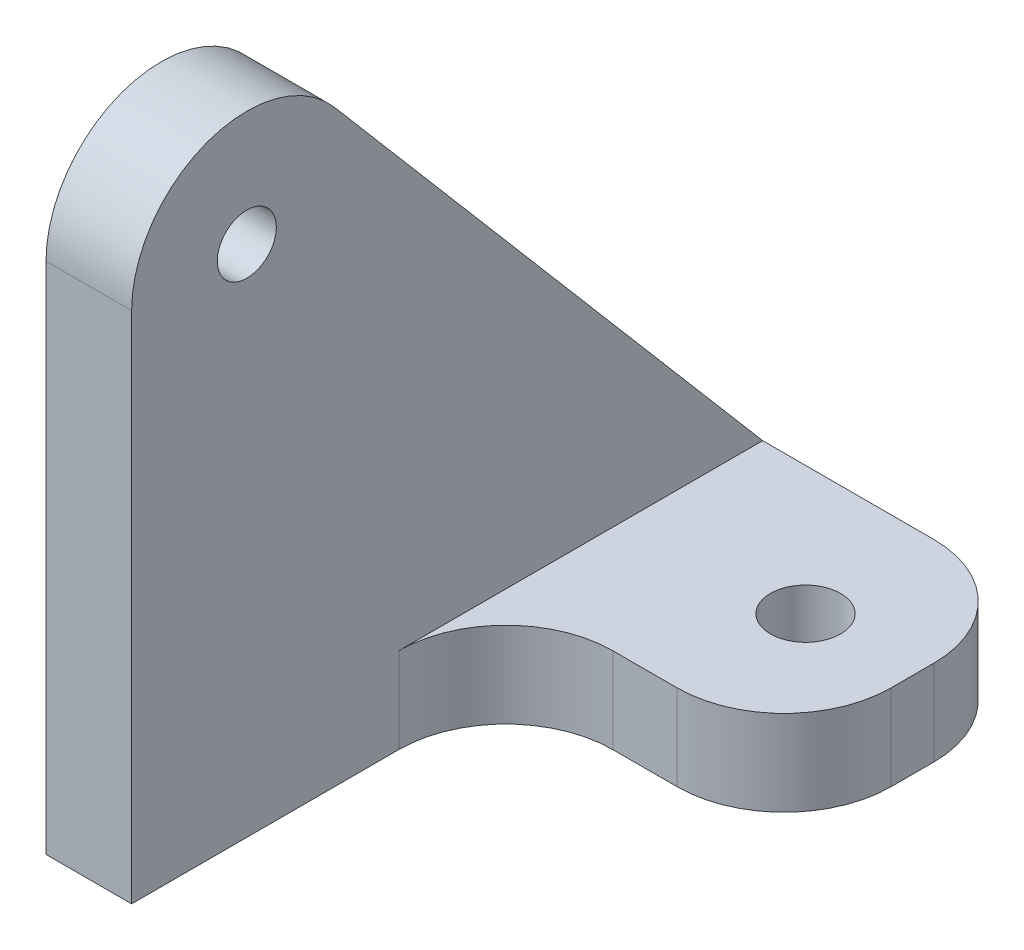
ISO-10303-21;
HEADER;
FILE_DESCRIPTION(('STEP AP214'),'2;1');
FILE_NAME('part.step','',(''),(''),'','','');
FILE_SCHEMA(('AUTOMOTIVE_DESIGN { 1 0 10303 214 1 1 1 1 }'));
ENDSEC;
DATA;
#1=APPLICATION_CONTEXT('core data for automotive mechanical design processes');
#2=APPLICATION_PROTOCOL_DEFINITION('international standard','automotive_design',2000,#1);
#3=PRODUCT_CONTEXT('',#1,'mechanical');
#4=PRODUCT('Part','Part','',(#3));
#5=PRODUCT_RELATED_PRODUCT_CATEGORY('part','',(#4));
#6=PRODUCT_DEFINITION_FORMATION('','',#4);
#7=PRODUCT_DEFINITION_CONTEXT('part definition',#1,'design');
#8=PRODUCT_DEFINITION('design','',#6,#7);
#9=PRODUCT_DEFINITION_SHAPE('','',#8);
#10=(LENGTH_UNIT() NAMED_UNIT(*) SI_UNIT(.MILLI.,.METRE.));
#11=(NAMED_UNIT(*) PLANE_ANGLE_UNIT() SI_UNIT($,.RADIAN.));
#12=(NAMED_UNIT(*) SI_UNIT($,.STERADIAN.) SOLID_ANGLE_UNIT());
#13=UNCERTAINTY_MEASURE_WITH_UNIT(LENGTH_MEASURE(1.E-05),#10,'distance_accuracy_value','');
#14=(GEOMETRIC_REPRESENTATION_CONTEXT(3) GLOBAL_UNCERTAINTY_ASSIGNED_CONTEXT((#13)) GLOBAL_UNIT_ASSIGNED_CONTEXT((#10,
#11,#12)) REPRESENTATION_CONTEXT('',''));
#15=CARTESIAN_POINT('',(0.,0.,0.));
#16=DIRECTION('',(0.,0.,1.));
#17=DIRECTION('',(1.,0.,0.));
#18=AXIS2_PLACEMENT_3D('',#15,#16,#17);
#19=CARTESIAN_POINT('',(12.7,5.08,-1.27));
#20=DIRECTION('',(0.,1.,0.));
#21=DIRECTION('',(0.,0.,1.));
#22=AXIS2_PLACEMENT_3D('',#19,#20,#21);
#23=PLANE('',#22);
#24=CARTESIAN_POINT('',(12.7,5.08,0.));
#25=DIRECTION('',(0.,1.,0.));
#26=DIRECTION('',(0.,0.,1.));
#27=AXIS2_PLACEMENT_3D('',#24,#25,#26);
#28=CIRCLE('',#27,2.0828);
#29=CARTESIAN_POINT('',(12.7,5.08,2.0828));
#30=VERTEX_POINT('',#29);
#31=EDGE_CURVE('E195',#30,#30,#28,.T.);
#32=ORIENTED_EDGE('',*,*,#31,.F.);
#33=EDGE_LOOP('',(#32));
#34=FACE_BOUND('',#33,.T.);
#35=DIRECTION('',(-1.,0.,0.));
#36=VECTOR('',#35,1.);
#37=CARTESIAN_POINT('',(-12.7,5.08,-7.62));
#38=LINE('',#37,#36);
#39=CARTESIAN_POINT('',(12.7,5.08,-7.62));
#40=VERTEX_POINT('',#39);
#41=CARTESIAN_POINT('',(2.54,5.08,-7.62));
#42=VERTEX_POINT('',#41);
#43=EDGE_CURVE('E212',#40,#42,#38,.T.);
#44=ORIENTED_EDGE('',*,*,#43,.T.);
#45=DIRECTION('',(0.,0.,1.));
#46=VECTOR('',#45,1.);
#47=CARTESIAN_POINT('',(2.54,5.08,-1.27));
#48=LINE('',#47,#46);
#49=CARTESIAN_POINT('',(2.54,5.08,13.97));
#50=VERTEX_POINT('',#49);
#51=EDGE_CURVE('E153',#42,#50,#48,.T.);
#52=ORIENTED_EDGE('',*,*,#51,.T.);
#53=CARTESIAN_POINT('',(8.89,5.08,13.97));
#54=DIRECTION('',(0.,1.,0.));
#55=DIRECTION('',(0.,0.,1.));
#56=AXIS2_PLACEMENT_3D('',#53,#54,#55);
#57=CIRCLE('',#56,6.35);
#58=CARTESIAN_POINT('',(8.89,5.08,7.61999999999999));
#59=VERTEX_POINT('',#58);
#60=EDGE_CURVE('E41',#50,#59,#57,.F.);
#61=ORIENTED_EDGE('',*,*,#60,.T.);
#62=DIRECTION('',(1.,0.,0.));
#63=VECTOR('',#62,1.);
#64=CARTESIAN_POINT('',(-12.6999999999999,5.08,7.61999999999999));
#65=LINE('',#64,#63);
#66=CARTESIAN_POINT('',(12.7,5.08,7.61999999999999));
#67=VERTEX_POINT('',#66);
#68=EDGE_CURVE('E221',#59,#67,#65,.T.);
#69=ORIENTED_EDGE('',*,*,#68,.T.);
#70=CARTESIAN_POINT('',(12.7,5.08,1.26999999999999));
#71=DIRECTION('',(0.,1.,0.));
#72=DIRECTION('',(0.,0.,-1.));
#73=AXIS2_PLACEMENT_3D('',#70,#71,#72);
#74=CIRCLE('',#73,6.35);
#75=CARTESIAN_POINT('',(19.05,5.08,1.26999999999995));
#76=VERTEX_POINT('',#75);
#77=EDGE_CURVE('E225',#67,#76,#74,.T.);
#78=ORIENTED_EDGE('',*,*,#77,.T.);
#79=DIRECTION('',(0.,0.,-1.));
#80=VECTOR('',#79,1.);
#81=CARTESIAN_POINT('',(19.05,5.08,1.26999999999995));
#82=LINE('',#81,#80);
#83=CARTESIAN_POINT('',(19.05,5.08,-1.27));
#84=VERTEX_POINT('',#83);
#85=EDGE_CURVE('E227',#76,#84,#82,.T.);
#86=ORIENTED_EDGE('',*,*,#85,.T.);
#87=CARTESIAN_POINT('',(12.7,5.08,-1.27));
#88=DIRECTION('',(0.,1.,0.));
#89=DIRECTION('',(0.,0.,1.));
#90=AXIS2_PLACEMENT_3D('',#87,#88,#89);
#91=CIRCLE('',#90,6.35);
#92=EDGE_CURVE('E207',#84,#40,#91,.T.);
#93=ORIENTED_EDGE('',*,*,#92,.T.);
#94=EDGE_LOOP('',(#44,#52,#61,#69,#78,#86,#93));
#95=FACE_BOUND('',#94,.T.);
#96=ADVANCED_FACE('F33',(#34,#95),#23,.T.);
#97=CARTESIAN_POINT('',(-12.6999999999999,5.08,7.61999999999999));
#98=DIRECTION('',(0.,0.,-1.));
#99=DIRECTION('',(-1.,0.,0.));
#100=AXIS2_PLACEMENT_3D('',#97,#98,#99);
#101=PLANE('',#100);
#102=ORIENTED_EDGE('',*,*,#68,.F.);
#103=DIRECTION('',(0.,1.,0.));
#104=VECTOR('',#103,1.);
#105=CARTESIAN_POINT('',(8.89,0.,7.61999999999999));
#106=LINE('',#105,#104);
#107=CARTESIAN_POINT('',(8.89,0.,7.61999999999999));
#108=VERTEX_POINT('',#107);
#109=EDGE_CURVE('E54',#59,#108,#106,.F.);
#110=ORIENTED_EDGE('',*,*,#109,.T.);
#111=DIRECTION('',(1.,0.,0.));
#112=VECTOR('',#111,1.);
#113=CARTESIAN_POINT('',(-12.6999999999999,0.,7.61999999999999));
#114=LINE('',#113,#112);
#115=CARTESIAN_POINT('',(12.7,0.,7.61999999999999));
#116=VERTEX_POINT('',#115);
#117=EDGE_CURVE('E240',#108,#116,#114,.T.);
#118=ORIENTED_EDGE('',*,*,#117,.T.);
#119=DIRECTION('',(0.,-1.,0.));
#120=VECTOR('',#119,1.);
#121=CARTESIAN_POINT('',(12.7,5.08,7.61999999999999));
#122=LINE('',#121,#120);
#123=EDGE_CURVE('E252',#67,#116,#122,.T.);
#124=ORIENTED_EDGE('',*,*,#123,.F.);
#125=EDGE_LOOP('',(#102,#110,#118,#124));
#126=FACE_BOUND('',#125,.T.);
#127=ADVANCED_FACE('F343',(#126),#101,.F.);
#128=DIRECTION('',(0.,0.,1.));
#129=VECTOR('',#128,1.);
#130=CARTESIAN_POINT('',(-2.54,5.08,-1.27));
#131=LINE('',#130,#129);
#132=CARTESIAN_POINT('',(-2.54,5.08,-7.62));
#133=VERTEX_POINT('',#132);
#134=CARTESIAN_POINT('',(-2.54,5.08,13.97));
#135=VERTEX_POINT('',#134);
#136=EDGE_CURVE('E191',#133,#135,#131,.T.);
#137=ORIENTED_EDGE('',*,*,#136,.F.);
#138=CARTESIAN_POINT('',(-12.7,5.08,-7.62));
#139=VERTEX_POINT('',#138);
#140=EDGE_CURVE('E210',#133,#139,#38,.T.);
#141=ORIENTED_EDGE('',*,*,#140,.T.);
#142=CARTESIAN_POINT('',(-12.7,5.08,-1.27));
#143=DIRECTION('',(0.,1.,0.));
#144=DIRECTION('',(0.,0.,-1.));
#145=AXIS2_PLACEMENT_3D('',#142,#143,#144);
#146=CIRCLE('',#145,6.35);
#147=CARTESIAN_POINT('',(-19.05,5.08,-1.27));
#148=VERTEX_POINT('',#147);
#149=EDGE_CURVE('E215',#139,#148,#146,.T.);
#150=ORIENTED_EDGE('',*,*,#149,.T.);
#151=DIRECTION('',(0.,0.,1.));
#152=VECTOR('',#151,1.);
#153=CARTESIAN_POINT('',(-19.05,5.08,1.26999999999995));
#154=LINE('',#153,#152);
#155=CARTESIAN_POINT('',(-19.05,5.08,1.26999999999995));
#156=VERTEX_POINT('',#155);
#157=EDGE_CURVE('E217',#148,#156,#154,.T.);
#158=ORIENTED_EDGE('',*,*,#157,.T.);
#159=CARTESIAN_POINT('',(-12.7,5.08,1.27));
#160=DIRECTION('',(0.,1.,0.));
#161=DIRECTION('',(0.,0.,-1.));
#162=AXIS2_PLACEMENT_3D('',#159,#160,#161);
#163=CIRCLE('',#162,6.35);
#164=CARTESIAN_POINT('',(-12.6999999999999,5.08,7.61999999999999));
#165=VERTEX_POINT('',#164);
#166=EDGE_CURVE('E219',#156,#165,#163,.T.);
#167=ORIENTED_EDGE('',*,*,#166,.T.);
#168=CARTESIAN_POINT('',(-8.89,5.08,7.61999999999999));
#169=VERTEX_POINT('',#168);
#170=EDGE_CURVE('E222',#165,#169,#65,.T.);
#171=ORIENTED_EDGE('',*,*,#170,.T.);
#172=CARTESIAN_POINT('',(-8.89,5.08,13.97));
#173=DIRECTION('',(0.,1.,0.));
#174=DIRECTION('',(0.,0.,1.));
#175=AXIS2_PLACEMENT_3D('',#172,#173,#174);
#176=CIRCLE('',#175,6.35);
#177=EDGE_CURVE('E278',#169,#135,#176,.F.);
#178=ORIENTED_EDGE('',*,*,#177,.T.);
#179=EDGE_LOOP('',(#137,#141,#150,#158,#167,#171,#178));
#180=FACE_BOUND('',#179,.T.);
#181=CARTESIAN_POINT('',(-12.7,5.08,0.));
#182=DIRECTION('',(0.,1.,0.));
#183=DIRECTION('',(0.,0.,1.));
#184=AXIS2_PLACEMENT_3D('',#181,#182,#183);
#185=CIRCLE('',#184,2.0828);
#186=CARTESIAN_POINT('',(-12.7,5.08,2.0828));
#187=VERTEX_POINT('',#186);
#188=EDGE_CURVE('E201',#187,#187,#185,.T.);
#189=ORIENTED_EDGE('',*,*,#188,.F.);
#190=EDGE_LOOP('',(#189));
#191=FACE_BOUND('',#190,.T.);
#192=ADVANCED_FACE('F299',(#180,#191),#23,.T.);
#193=CARTESIAN_POINT('',(12.7,0.,-1.27));
#194=DIRECTION('',(0.,1.,0.));
#195=DIRECTION('',(0.,0.,1.));
#196=AXIS2_PLACEMENT_3D('',#193,#194,#195);
#197=PLANE('',#196);
#198=CARTESIAN_POINT('',(-12.7,0.,-1.27));
#199=DIRECTION('',(0.,1.,0.));
#200=DIRECTION('',(0.,0.,-1.));
#201=AXIS2_PLACEMENT_3D('',#198,#199,#200);
#202=CIRCLE('',#201,6.35);
#203=CARTESIAN_POINT('',(-12.7,0.,-7.62));
#204=VERTEX_POINT('',#203);
#205=CARTESIAN_POINT('',(-19.05,0.,-1.27));
#206=VERTEX_POINT('',#205);
#207=EDGE_CURVE('E234',#204,#206,#202,.T.);
#208=ORIENTED_EDGE('',*,*,#207,.F.);
#209=DIRECTION('',(-1.,0.,0.));
#210=VECTOR('',#209,1.);
#211=CARTESIAN_POINT('',(-12.7,0.,-7.62));
#212=LINE('',#211,#210);
#213=CARTESIAN_POINT('',(12.7,0.,-7.62));
#214=VERTEX_POINT('',#213);
#215=EDGE_CURVE('E232',#214,#204,#212,.T.);
#216=ORIENTED_EDGE('',*,*,#215,.F.);
#217=CARTESIAN_POINT('',(12.7,0.,-1.27));
#218=DIRECTION('',(0.,1.,0.));
#219=DIRECTION('',(0.,0.,1.));
#220=AXIS2_PLACEMENT_3D('',#217,#218,#219);
#221=CIRCLE('',#220,6.35);
#222=CARTESIAN_POINT('',(19.05,0.,-1.27));
#223=VERTEX_POINT('',#222);
#224=EDGE_CURVE('E204',#223,#214,#221,.T.);
#225=ORIENTED_EDGE('',*,*,#224,.F.);
#226=DIRECTION('',(0.,0.,-1.));
#227=VECTOR('',#226,1.);
#228=CARTESIAN_POINT('',(19.05,0.,1.26999999999995));
#229=LINE('',#228,#227);
#230=CARTESIAN_POINT('',(19.05,0.,1.26999999999995));
#231=VERTEX_POINT('',#230);
#232=EDGE_CURVE('E211',#231,#223,#229,.T.);
#233=ORIENTED_EDGE('',*,*,#232,.F.);
#234=CARTESIAN_POINT('',(12.7,0.,1.26999999999999));
#235=DIRECTION('',(0.,1.,0.));
#236=DIRECTION('',(0.,0.,-1.));
#237=AXIS2_PLACEMENT_3D('',#234,#235,#236);
#238=CIRCLE('',#237,6.35);
#239=EDGE_CURVE('E244',#116,#231,#238,.T.);
#240=ORIENTED_EDGE('',*,*,#239,.F.);
#241=ORIENTED_EDGE('',*,*,#117,.F.);
#242=CARTESIAN_POINT('',(8.89,0.,13.97));
#243=DIRECTION('',(0.,1.,0.));
#244=DIRECTION('',(0.,0.,1.));
#245=AXIS2_PLACEMENT_3D('',#242,#243,#244);
#246=CIRCLE('',#245,6.35);
#247=CARTESIAN_POINT('',(2.54,0.,13.97));
#248=VERTEX_POINT('',#247);
#249=EDGE_CURVE('E11',#108,#248,#246,.T.);
#250=ORIENTED_EDGE('',*,*,#249,.T.);
#251=DIRECTION('',(0.,0.,-1.));
#252=VECTOR('',#251,1.);
#253=CARTESIAN_POINT('',(2.54,0.,29.8196));
#254=LINE('',#253,#252);
#255=CARTESIAN_POINT('',(2.54,0.,29.8196));
#256=VERTEX_POINT('',#255);
#257=EDGE_CURVE('E173',#256,#248,#254,.T.);
#258=ORIENTED_EDGE('',*,*,#257,.F.);
#259=DIRECTION('',(-1.,0.,0.));
#260=VECTOR('',#259,1.);
#261=CARTESIAN_POINT('',(2.54,0.,29.8196));
#262=LINE('',#261,#260);
#263=CARTESIAN_POINT('',(-2.54,0.,29.8196));
#264=VERTEX_POINT('',#263);
#265=EDGE_CURVE('E178',#256,#264,#262,.T.);
#266=ORIENTED_EDGE('',*,*,#265,.T.);
#267=DIRECTION('',(0.,0.,-1.));
#268=VECTOR('',#267,1.);
#269=CARTESIAN_POINT('',(-2.54,0.,29.8196));
#270=LINE('',#269,#268);
#271=CARTESIAN_POINT('',(-2.54,0.,13.97));
#272=VERTEX_POINT('',#271);
#273=EDGE_CURVE('E156',#264,#272,#270,.T.);
#274=ORIENTED_EDGE('',*,*,#273,.T.);
#275=CARTESIAN_POINT('',(-8.89,0.,13.97));
#276=DIRECTION('',(0.,1.,0.));
#277=DIRECTION('',(0.,0.,1.));
#278=AXIS2_PLACEMENT_3D('',#275,#276,#277);
#279=CIRCLE('',#278,6.35);
#280=CARTESIAN_POINT('',(-8.89,0.,7.61999999999999));
#281=VERTEX_POINT('',#280);
#282=EDGE_CURVE('E281',#272,#281,#279,.T.);
#283=ORIENTED_EDGE('',*,*,#282,.T.);
#284=CARTESIAN_POINT('',(-12.6999999999999,0.,7.61999999999999));
#285=VERTEX_POINT('',#284);
#286=EDGE_CURVE('E241',#285,#281,#114,.T.);
#287=ORIENTED_EDGE('',*,*,#286,.F.);
#288=CARTESIAN_POINT('',(-12.7,0.,1.27));
#289=DIRECTION('',(0.,1.,0.));
#290=DIRECTION('',(0.,0.,-1.));
#291=AXIS2_PLACEMENT_3D('',#288,#289,#290);
#292=CIRCLE('',#291,6.35);
#293=CARTESIAN_POINT('',(-19.05,0.,1.26999999999995));
#294=VERTEX_POINT('',#293);
#295=EDGE_CURVE('E238',#294,#285,#292,.T.);
#296=ORIENTED_EDGE('',*,*,#295,.F.);
#297=DIRECTION('',(0.,0.,1.));
#298=VECTOR('',#297,1.);
#299=CARTESIAN_POINT('',(-19.05,0.,1.26999999999995));
#300=LINE('',#299,#298);
#301=EDGE_CURVE('E236',#206,#294,#300,.T.);
#302=ORIENTED_EDGE('',*,*,#301,.F.);
#303=EDGE_LOOP('',(#208,#216,#225,#233,#240,#241,#250,#258,#266,#274,#283,#287,#296,#302));
#304=FACE_BOUND('',#303,.T.);
#305=CARTESIAN_POINT('',(-12.7,0.,0.));
#306=DIRECTION('',(0.,1.,0.));
#307=DIRECTION('',(0.,0.,1.));
#308=AXIS2_PLACEMENT_3D('',#305,#306,#307);
#309=CIRCLE('',#308,2.0828);
#310=CARTESIAN_POINT('',(-12.7,0.,2.0828));
#311=VERTEX_POINT('',#310);
#312=EDGE_CURVE('E198',#311,#311,#309,.T.);
#313=ORIENTED_EDGE('',*,*,#312,.T.);
#314=EDGE_LOOP('',(#313));
#315=FACE_BOUND('',#314,.T.);
#316=CARTESIAN_POINT('',(12.7,0.,0.));
#317=DIRECTION('',(0.,1.,0.));
#318=DIRECTION('',(0.,0.,1.));
#319=AXIS2_PLACEMENT_3D('',#316,#317,#318);
#320=CIRCLE('',#319,2.0828);
#321=CARTESIAN_POINT('',(12.7,0.,2.0828));
#322=VERTEX_POINT('',#321);
#323=EDGE_CURVE('E194',#322,#322,#320,.T.);
#324=ORIENTED_EDGE('',*,*,#323,.T.);
#325=EDGE_LOOP('',(#324));
#326=FACE_BOUND('',#325,.T.);
#327=ADVANCED_FACE('F286',(#304,#315,#326),#197,.F.);
#328=CARTESIAN_POINT('',(12.7,5.08,-1.27));
#329=DIRECTION('',(0.,-1.,0.));
#330=DIRECTION('',(0.,0.,-1.));
#331=AXIS2_PLACEMENT_3D('',#328,#329,#330);
#332=CYLINDRICAL_SURFACE('',#331,6.35);
#333=ORIENTED_EDGE('',*,*,#224,.T.);
#334=DIRECTION('',(0.,-1.,0.));
#335=VECTOR('',#334,1.);
#336=CARTESIAN_POINT('',(12.7,5.08,-7.62));
#337=LINE('',#336,#335);
#338=EDGE_CURVE('E267',#40,#214,#337,.T.);
#339=ORIENTED_EDGE('',*,*,#338,.F.);
#340=ORIENTED_EDGE('',*,*,#92,.F.);
#341=DIRECTION('',(0.,-1.,0.));
#342=VECTOR('',#341,1.);
#343=CARTESIAN_POINT('',(19.05,5.08,-1.27));
#344=LINE('',#343,#342);
#345=EDGE_CURVE('E229',#84,#223,#344,.T.);
#346=ORIENTED_EDGE('',*,*,#345,.T.);
#347=EDGE_LOOP('',(#333,#339,#340,#346));
#348=FACE_BOUND('',#347,.T.);
#349=ADVANCED_FACE('F322',(#348),#332,.T.);
#350=CARTESIAN_POINT('',(-12.7,5.08,-7.62));
#351=DIRECTION('',(0.,0.,1.));
#352=DIRECTION('',(1.,0.,0.));
#353=AXIS2_PLACEMENT_3D('',#350,#351,#352);
#354=PLANE('',#353);
#355=ORIENTED_EDGE('',*,*,#140,.F.);
#356=DIRECTION('',(-1.,0.,0.));
#357=VECTOR('',#356,1.);
#358=CARTESIAN_POINT('',(2.54,5.08,-7.62));
#359=LINE('',#358,#357);
#360=EDGE_CURVE('E165',#42,#133,#359,.T.);
#361=ORIENTED_EDGE('',*,*,#360,.F.);
#362=ORIENTED_EDGE('',*,*,#43,.F.);
#363=ORIENTED_EDGE('',*,*,#338,.T.);
#364=ORIENTED_EDGE('',*,*,#215,.T.);
#365=DIRECTION('',(0.,-1.,0.));
#366=VECTOR('',#365,1.);
#367=CARTESIAN_POINT('',(-12.7,5.08,-7.62));
#368=LINE('',#367,#366);
#369=EDGE_CURVE('E264',#139,#204,#368,.T.);
#370=ORIENTED_EDGE('',*,*,#369,.F.);
#371=EDGE_LOOP('',(#355,#361,#362,#363,#364,#370));
#372=FACE_BOUND('',#371,.T.);
#373=ADVANCED_FACE('F316',(#372),#354,.F.);
#374=CARTESIAN_POINT('',(-12.7,5.08,-1.27));
#375=DIRECTION('',(0.,-1.,0.));
#376=DIRECTION('',(0.,0.,-1.));
#377=AXIS2_PLACEMENT_3D('',#374,#375,#376);
#378=CYLINDRICAL_SURFACE('',#377,6.35);
#379=ORIENTED_EDGE('',*,*,#207,.T.);
#380=DIRECTION('',(0.,-1.,0.));
#381=VECTOR('',#380,1.);
#382=CARTESIAN_POINT('',(-19.05,5.08,-1.27));
#383=LINE('',#382,#381);
#384=EDGE_CURVE('E261',#148,#206,#383,.T.);
#385=ORIENTED_EDGE('',*,*,#384,.F.);
#386=ORIENTED_EDGE('',*,*,#149,.F.);
#387=ORIENTED_EDGE('',*,*,#369,.T.);
#388=EDGE_LOOP('',(#379,#385,#386,#387));
#389=FACE_BOUND('',#388,.T.);
#390=ADVANCED_FACE('F313',(#389),#378,.T.);
#391=CARTESIAN_POINT('',(-19.05,5.08,1.26999999999995));
#392=DIRECTION('',(1.,0.,0.));
#393=DIRECTION('',(0.,0.,-1.));
#394=AXIS2_PLACEMENT_3D('',#391,#392,#393);
#395=PLANE('',#394);
#396=ORIENTED_EDGE('',*,*,#301,.T.);
#397=DIRECTION('',(0.,-1.,0.));
#398=VECTOR('',#397,1.);
#399=CARTESIAN_POINT('',(-19.05,5.08,1.26999999999995));
#400=LINE('',#399,#398);
#401=EDGE_CURVE('E258',#156,#294,#400,.T.);
#402=ORIENTED_EDGE('',*,*,#401,.F.);
#403=ORIENTED_EDGE('',*,*,#157,.F.);
#404=ORIENTED_EDGE('',*,*,#384,.T.);
#405=EDGE_LOOP('',(#396,#402,#403,#404));
#406=FACE_BOUND('',#405,.T.);
#407=ADVANCED_FACE('F309',(#406),#395,.F.);
#408=CARTESIAN_POINT('',(-12.7,5.08,1.27));
#409=DIRECTION('',(0.,-1.,0.));
#410=DIRECTION('',(0.,0.,-1.));
#411=AXIS2_PLACEMENT_3D('',#408,#409,#410);
#412=CYLINDRICAL_SURFACE('',#411,6.35);
#413=ORIENTED_EDGE('',*,*,#295,.T.);
#414=DIRECTION('',(0.,-1.,0.));
#415=VECTOR('',#414,1.);
#416=CARTESIAN_POINT('',(-12.6999999999999,5.08,7.61999999999999));
#417=LINE('',#416,#415);
#418=EDGE_CURVE('E255',#165,#285,#417,.T.);
#419=ORIENTED_EDGE('',*,*,#418,.F.);
#420=ORIENTED_EDGE('',*,*,#166,.F.);
#421=ORIENTED_EDGE('',*,*,#401,.T.);
#422=EDGE_LOOP('',(#413,#419,#420,#421));
#423=FACE_BOUND('',#422,.T.);
#424=ADVANCED_FACE('F306',(#423),#412,.T.);
#425=ORIENTED_EDGE('',*,*,#286,.T.);
#426=DIRECTION('',(0.,1.,0.));
#427=VECTOR('',#426,1.);
#428=CARTESIAN_POINT('',(-8.89,5.08,7.61999999999999));
#429=LINE('',#428,#427);
#430=EDGE_CURVE('E270',#281,#169,#429,.T.);
#431=ORIENTED_EDGE('',*,*,#430,.T.);
#432=ORIENTED_EDGE('',*,*,#170,.F.);
#433=ORIENTED_EDGE('',*,*,#418,.T.);
#434=EDGE_LOOP('',(#425,#431,#432,#433));
#435=FACE_BOUND('',#434,.T.);
#436=ADVANCED_FACE('F294',(#435),#101,.F.);
#437=CARTESIAN_POINT('',(12.7,5.08,1.26999999999999));
#438=DIRECTION('',(0.,-1.,0.));
#439=DIRECTION('',(0.,0.,-1.));
#440=AXIS2_PLACEMENT_3D('',#437,#438,#439);
#441=CYLINDRICAL_SURFACE('',#440,6.35);
#442=ORIENTED_EDGE('',*,*,#239,.T.);
#443=DIRECTION('',(0.,-1.,0.));
#444=VECTOR('',#443,1.);
#445=CARTESIAN_POINT('',(19.05,5.08,1.26999999999995));
#446=LINE('',#445,#444);
#447=EDGE_CURVE('E249',#76,#231,#446,.T.);
#448=ORIENTED_EDGE('',*,*,#447,.F.);
#449=ORIENTED_EDGE('',*,*,#77,.F.);
#450=ORIENTED_EDGE('',*,*,#123,.T.);
#451=EDGE_LOOP('',(#442,#448,#449,#450));
#452=FACE_BOUND('',#451,.T.);
#453=ADVANCED_FACE('F331',(#452),#441,.T.);
#454=CARTESIAN_POINT('',(19.05,5.08,1.26999999999995));
#455=DIRECTION('',(-1.,0.,0.));
#456=DIRECTION('',(0.,0.,1.));
#457=AXIS2_PLACEMENT_3D('',#454,#455,#456);
#458=PLANE('',#457);
#459=ORIENTED_EDGE('',*,*,#232,.T.);
#460=ORIENTED_EDGE('',*,*,#345,.F.);
#461=ORIENTED_EDGE('',*,*,#85,.F.);
#462=ORIENTED_EDGE('',*,*,#447,.T.);
#463=EDGE_LOOP('',(#459,#460,#461,#462));
#464=FACE_BOUND('',#463,.T.);
#465=ADVANCED_FACE('F327',(#464),#458,.F.);
#466=CARTESIAN_POINT('',(-12.7,5.08,0.));
#467=DIRECTION('',(0.,-1.,0.));
#468=DIRECTION('',(0.,0.,-1.));
#469=AXIS2_PLACEMENT_3D('',#466,#467,#468);
#470=CYLINDRICAL_SURFACE('',#469,2.0828);
#471=ORIENTED_EDGE('',*,*,#188,.T.);
#472=EDGE_LOOP('',(#471));
#473=FACE_BOUND('',#472,.T.);
#474=ORIENTED_EDGE('',*,*,#312,.F.);
#475=EDGE_LOOP('',(#474));
#476=FACE_BOUND('',#475,.T.);
#477=ADVANCED_FACE('F398',(#473,#476),#470,.F.);
#478=CARTESIAN_POINT('',(12.7,5.08,0.));
#479=DIRECTION('',(0.,-1.,0.));
#480=DIRECTION('',(0.,0.,-1.));
#481=AXIS2_PLACEMENT_3D('',#478,#479,#480);
#482=CYLINDRICAL_SURFACE('',#481,2.0828);
#483=ORIENTED_EDGE('',*,*,#31,.T.);
#484=EDGE_LOOP('',(#483));
#485=FACE_BOUND('',#484,.T.);
#486=ORIENTED_EDGE('',*,*,#323,.F.);
#487=EDGE_LOOP('',(#486));
#488=FACE_BOUND('',#487,.T.);
#489=ADVANCED_FACE('F389',(#485,#488),#482,.F.);
#490=CARTESIAN_POINT('',(2.54,30.48,22.987));
#491=DIRECTION('',(-1.,0.,0.));
#492=DIRECTION('',(0.,0.,1.));
#493=AXIS2_PLACEMENT_3D('',#490,#491,#492);
#494=PLANE('',#493);
#495=ORIENTED_EDGE('',*,*,#257,.T.);
#496=DIRECTION('',(0.,1.,0.));
#497=VECTOR('',#496,1.);
#498=CARTESIAN_POINT('',(2.54,5.08,13.97));
#499=LINE('',#498,#497);
#500=EDGE_CURVE('E275',#248,#50,#499,.T.);
#501=ORIENTED_EDGE('',*,*,#500,.T.);
#502=ORIENTED_EDGE('',*,*,#51,.F.);
#503=DIRECTION('',(0.,0.761313999647172,0.648383369574842));
#504=VECTOR('',#503,1.);
#505=CARTESIAN_POINT('',(2.54,5.08,-7.62));
#506=LINE('',#505,#504);
#507=CARTESIAN_POINT('',(2.54,34.9101442109571,17.7852459660107));
#508=VERTEX_POINT('',#507);
#509=EDGE_CURVE('E144',#42,#508,#506,.T.);
#510=ORIENTED_EDGE('',*,*,#509,.T.);
#511=CARTESIAN_POINT('',(2.54,30.48,22.987));
#512=DIRECTION('',(1.,0.,0.));
#513=DIRECTION('',(0.,0.,1.));
#514=AXIS2_PLACEMENT_3D('',#511,#512,#513);
#515=CIRCLE('',#514,6.8326);
#516=CARTESIAN_POINT('',(2.54,30.48,29.8196));
#517=VERTEX_POINT('',#516);
#518=EDGE_CURVE('E150',#508,#517,#515,.T.);
#519=ORIENTED_EDGE('',*,*,#518,.T.);
#520=DIRECTION('',(0.,-1.,0.));
#521=VECTOR('',#520,1.);
#522=CARTESIAN_POINT('',(2.54,30.48,29.8196));
#523=LINE('',#522,#521);
#524=EDGE_CURVE('E171',#517,#256,#523,.T.);
#525=ORIENTED_EDGE('',*,*,#524,.T.);
#526=EDGE_LOOP('',(#495,#501,#502,#510,#519,#525));
#527=FACE_BOUND('',#526,.T.);
#528=CARTESIAN_POINT('',(2.54,30.48,22.987));
#529=DIRECTION('',(1.,0.,0.));
#530=DIRECTION('',(0.,0.,-1.));
#531=AXIS2_PLACEMENT_3D('',#528,#529,#530);
#532=CIRCLE('',#531,1.7526);
#533=CARTESIAN_POINT('',(2.54,30.48,21.2344));
#534=VERTEX_POINT('',#533);
#535=EDGE_CURVE('E181',#534,#534,#532,.T.);
#536=ORIENTED_EDGE('',*,*,#535,.F.);
#537=EDGE_LOOP('',(#536));
#538=FACE_BOUND('',#537,.T.);
#539=ADVANCED_FACE('F147',(#527,#538),#494,.F.);
#540=CARTESIAN_POINT('',(-2.54,30.48,22.987));
#541=DIRECTION('',(-1.,0.,0.));
#542=DIRECTION('',(0.,0.,1.));
#543=AXIS2_PLACEMENT_3D('',#540,#541,#542);
#544=PLANE('',#543);
#545=ORIENTED_EDGE('',*,*,#136,.T.);
#546=DIRECTION('',(0.,1.,0.));
#547=VECTOR('',#546,1.);
#548=CARTESIAN_POINT('',(-2.54,30.48,13.97));
#549=LINE('',#548,#547);
#550=EDGE_CURVE('E273',#135,#272,#549,.F.);
#551=ORIENTED_EDGE('',*,*,#550,.T.);
#552=ORIENTED_EDGE('',*,*,#273,.F.);
#553=DIRECTION('',(0.,-1.,0.));
#554=VECTOR('',#553,1.);
#555=CARTESIAN_POINT('',(-2.54,30.48,29.8196));
#556=LINE('',#555,#554);
#557=CARTESIAN_POINT('',(-2.54,30.48,29.8196));
#558=VERTEX_POINT('',#557);
#559=EDGE_CURVE('E183',#558,#264,#556,.T.);
#560=ORIENTED_EDGE('',*,*,#559,.F.);
#561=CARTESIAN_POINT('',(-2.54,30.48,22.987));
#562=DIRECTION('',(1.,0.,0.));
#563=DIRECTION('',(0.,0.,1.));
#564=AXIS2_PLACEMENT_3D('',#561,#562,#563);
#565=CIRCLE('',#564,6.8326);
#566=CARTESIAN_POINT('',(-2.54,34.9101442109571,17.7852459660107));
#567=VERTEX_POINT('',#566);
#568=EDGE_CURVE('E180',#567,#558,#565,.T.);
#569=ORIENTED_EDGE('',*,*,#568,.F.);
#570=DIRECTION('',(0.,0.761313999647172,0.648383369574842));
#571=VECTOR('',#570,1.);
#572=CARTESIAN_POINT('',(-2.54,5.08,-7.62));
#573=LINE('',#572,#571);
#574=EDGE_CURVE('E162',#133,#567,#573,.T.);
#575=ORIENTED_EDGE('',*,*,#574,.F.);
#576=EDGE_LOOP('',(#545,#551,#552,#560,#569,#575));
#577=FACE_BOUND('',#576,.T.);
#578=CARTESIAN_POINT('',(-2.54,30.48,22.987));
#579=DIRECTION('',(1.,0.,0.));
#580=DIRECTION('',(0.,0.,-1.));
#581=AXIS2_PLACEMENT_3D('',#578,#579,#580);
#582=CIRCLE('',#581,1.7526);
#583=CARTESIAN_POINT('',(-2.54,30.48,21.2344));
#584=VERTEX_POINT('',#583);
#585=EDGE_CURVE('E539',#584,#584,#582,.T.);
#586=ORIENTED_EDGE('',*,*,#585,.T.);
#587=EDGE_LOOP('',(#586));
#588=FACE_BOUND('',#587,.T.);
#589=ADVANCED_FACE('F341',(#577,#588),#544,.T.);
#590=CARTESIAN_POINT('',(2.54,5.08,-7.62));
#591=DIRECTION('',(0.,-0.648383369574842,0.761313999647172));
#592=DIRECTION('',(0.,-0.761313999647172,-0.648383369574842));
#593=AXIS2_PLACEMENT_3D('',#590,#591,#592);
#594=PLANE('',#593);
#595=ORIENTED_EDGE('',*,*,#574,.T.);
#596=DIRECTION('',(-1.,0.,0.));
#597=VECTOR('',#596,1.);
#598=CARTESIAN_POINT('',(2.54,34.9101442109571,17.7852459660107));
#599=LINE('',#598,#597);
#600=EDGE_CURVE('E159',#508,#567,#599,.T.);
#601=ORIENTED_EDGE('',*,*,#600,.F.);
#602=ORIENTED_EDGE('',*,*,#509,.F.);
#603=ORIENTED_EDGE('',*,*,#360,.T.);
#604=EDGE_LOOP('',(#595,#601,#602,#603));
#605=FACE_BOUND('',#604,.T.);
#606=ADVANCED_FACE('F160',(#605),#594,.F.);
#607=CARTESIAN_POINT('',(2.54,30.48,22.987));
#608=DIRECTION('',(-1.,0.,0.));
#609=DIRECTION('',(0.,0.,1.));
#610=AXIS2_PLACEMENT_3D('',#607,#608,#609);
#611=CYLINDRICAL_SURFACE('',#610,6.8326);
#612=ORIENTED_EDGE('',*,*,#568,.T.);
#613=DIRECTION('',(-1.,0.,0.));
#614=VECTOR('',#613,1.);
#615=CARTESIAN_POINT('',(2.54,30.48,29.8196));
#616=LINE('',#615,#614);
#617=EDGE_CURVE('E166',#517,#558,#616,.T.);
#618=ORIENTED_EDGE('',*,*,#617,.F.);
#619=ORIENTED_EDGE('',*,*,#518,.F.);
#620=ORIENTED_EDGE('',*,*,#600,.T.);
#621=EDGE_LOOP('',(#612,#618,#619,#620));
#622=FACE_BOUND('',#621,.T.);
#623=ADVANCED_FACE('F168',(#622),#611,.T.);
#624=CARTESIAN_POINT('',(2.54,30.48,29.8196));
#625=DIRECTION('',(0.,0.,-1.));
#626=DIRECTION('',(0.,1.,0.));
#627=AXIS2_PLACEMENT_3D('',#624,#625,#626);
#628=PLANE('',#627);
#629=ORIENTED_EDGE('',*,*,#559,.T.);
#630=ORIENTED_EDGE('',*,*,#265,.F.);
#631=ORIENTED_EDGE('',*,*,#524,.F.);
#632=ORIENTED_EDGE('',*,*,#617,.T.);
#633=EDGE_LOOP('',(#629,#630,#631,#632));
#634=FACE_BOUND('',#633,.T.);
#635=ADVANCED_FACE('F377',(#634),#628,.F.);
#636=CARTESIAN_POINT('',(2.54,30.48,22.987));
#637=DIRECTION('',(-1.,0.,0.));
#638=DIRECTION('',(0.,0.,1.));
#639=AXIS2_PLACEMENT_3D('',#636,#637,#638);
#640=CYLINDRICAL_SURFACE('',#639,1.7526);
#641=ORIENTED_EDGE('',*,*,#535,.T.);
#642=EDGE_LOOP('',(#641));
#643=FACE_BOUND('',#642,.T.);
#644=ORIENTED_EDGE('',*,*,#585,.F.);
#645=EDGE_LOOP('',(#644));
#646=FACE_BOUND('',#645,.T.);
#647=ADVANCED_FACE('F372',(#643,#646),#640,.F.);
#648=CARTESIAN_POINT('',(-8.89,5.08,13.97));
#649=DIRECTION('',(0.,1.,0.));
#650=DIRECTION('',(0.,0.,1.));
#651=AXIS2_PLACEMENT_3D('',#648,#649,#650);
#652=CYLINDRICAL_SURFACE('',#651,6.35);
#653=ORIENTED_EDGE('',*,*,#282,.F.);
#654=ORIENTED_EDGE('',*,*,#550,.F.);
#655=ORIENTED_EDGE('',*,*,#177,.F.);
#656=ORIENTED_EDGE('',*,*,#430,.F.);
#657=EDGE_LOOP('',(#653,#654,#655,#656));
#658=FACE_BOUND('',#657,.T.);
#659=ADVANCED_FACE('F297',(#658),#652,.F.);
#660=CARTESIAN_POINT('',(8.89,30.48,13.97));
#661=DIRECTION('',(0.,-1.,0.));
#662=DIRECTION('',(0.,0.,-1.));
#663=AXIS2_PLACEMENT_3D('',#660,#661,#662);
#664=CYLINDRICAL_SURFACE('',#663,6.35);
#665=ORIENTED_EDGE('',*,*,#249,.F.);
#666=ORIENTED_EDGE('',*,*,#109,.F.);
#667=ORIENTED_EDGE('',*,*,#60,.F.);
#668=ORIENTED_EDGE('',*,*,#500,.F.);
#669=EDGE_LOOP('',(#665,#666,#667,#668));
#670=FACE_BOUND('',#669,.T.);
#671=ADVANCED_FACE('F35',(#670),#664,.F.);
#672=CLOSED_SHELL('',(#96,#127,#192,#327,#349,#373,#390,#407,#424,#436,#453,#465,#477,#489,#539,
#589,#606,#623,#635,#647,#659,#671));
#673=MANIFOLD_SOLID_BREP('B2',#672);
#674=ADVANCED_BREP_SHAPE_REPRESENTATION('',(#18,#673),#14);
#675=SHAPE_DEFINITION_REPRESENTATION(#9,#674);
ENDSEC;
END-ISO-10303-21;
